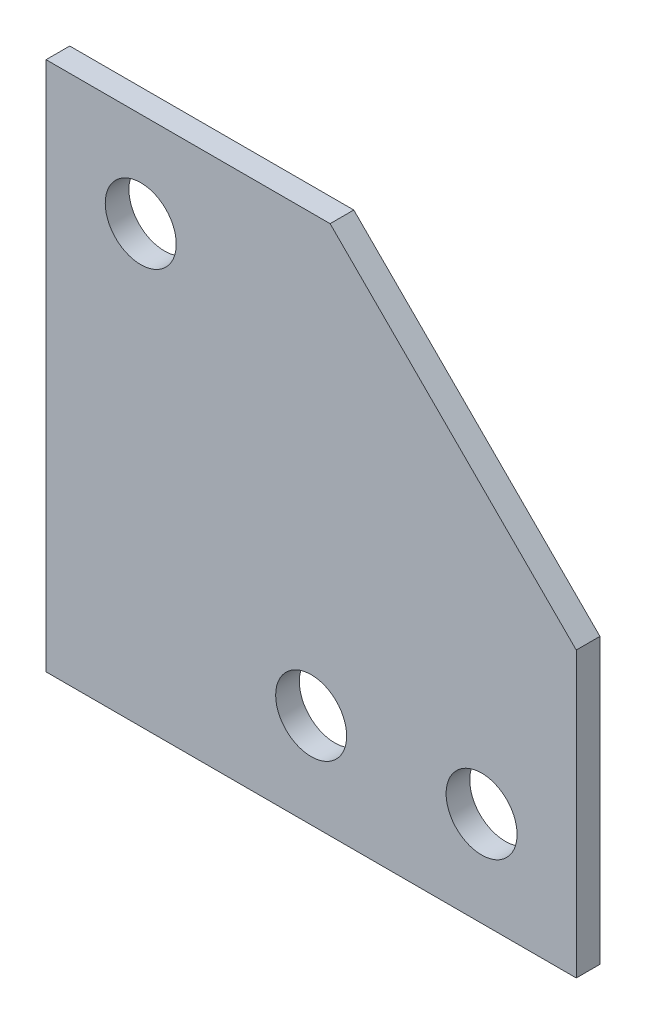
ISO-10303-21;
HEADER;
FILE_DESCRIPTION(('STEP AP214'),'2;1');
FILE_NAME('part.step','',(''),(''),'','','');
FILE_SCHEMA(('AUTOMOTIVE_DESIGN { 1 0 10303 214 1 1 1 1 }'));
ENDSEC;
DATA;
#1=APPLICATION_CONTEXT('core data for automotive mechanical design processes');
#2=APPLICATION_PROTOCOL_DEFINITION('international standard','automotive_design',2000,#1);
#3=PRODUCT_CONTEXT('',#1,'mechanical');
#4=PRODUCT('Part','Part','',(#3));
#5=PRODUCT_RELATED_PRODUCT_CATEGORY('part','',(#4));
#6=PRODUCT_DEFINITION_FORMATION('','',#4);
#7=PRODUCT_DEFINITION_CONTEXT('part definition',#1,'design');
#8=PRODUCT_DEFINITION('design','',#6,#7);
#9=PRODUCT_DEFINITION_SHAPE('','',#8);
#10=(LENGTH_UNIT() NAMED_UNIT(*) SI_UNIT(.MILLI.,.METRE.));
#11=(NAMED_UNIT(*) PLANE_ANGLE_UNIT() SI_UNIT($,.RADIAN.));
#12=(NAMED_UNIT(*) SI_UNIT($,.STERADIAN.) SOLID_ANGLE_UNIT());
#13=UNCERTAINTY_MEASURE_WITH_UNIT(LENGTH_MEASURE(1.E-05),#10,'distance_accuracy_value','');
#14=(GEOMETRIC_REPRESENTATION_CONTEXT(3) GLOBAL_UNCERTAINTY_ASSIGNED_CONTEXT((#13)) GLOBAL_UNIT_ASSIGNED_CONTEXT((#10,
#11,#12)) REPRESENTATION_CONTEXT('',''));
#15=CARTESIAN_POINT('',(0.,0.,0.));
#16=DIRECTION('',(0.,0.,1.));
#17=DIRECTION('',(1.,0.,0.));
#18=AXIS2_PLACEMENT_3D('',#15,#16,#17);
#19=CARTESIAN_POINT('',(0.,0.,1.5875));
#20=DIRECTION('',(1.,0.,0.));
#21=DIRECTION('',(0.,0.,-1.));
#22=AXIS2_PLACEMENT_3D('',#19,#20,#21);
#23=PLANE('',#22);
#24=DIRECTION('',(0.,-1.,0.));
#25=VECTOR('',#24,1.);
#26=CARTESIAN_POINT('',(0.,0.,0.));
#27=LINE('',#26,#25);
#28=CARTESIAN_POINT('',(0.,0.,0.));
#29=VERTEX_POINT('',#28);
#30=CARTESIAN_POINT('',(0.,-35.56,0.));
#31=VERTEX_POINT('',#30);
#32=EDGE_CURVE('E118',#29,#31,#27,.T.);
#33=ORIENTED_EDGE('',*,*,#32,.T.);
#34=DIRECTION('',(0.,0.,-1.));
#35=VECTOR('',#34,1.);
#36=CARTESIAN_POINT('',(0.,-35.56,1.5875));
#37=LINE('',#36,#35);
#38=CARTESIAN_POINT('',(0.,-35.56,1.5875));
#39=VERTEX_POINT('',#38);
#40=EDGE_CURVE('E11',#39,#31,#37,.T.);
#41=ORIENTED_EDGE('',*,*,#40,.F.);
#42=DIRECTION('',(0.,-1.,0.));
#43=VECTOR('',#42,1.);
#44=CARTESIAN_POINT('',(0.,0.,1.5875));
#45=LINE('',#44,#43);
#46=CARTESIAN_POINT('',(0.,0.,1.5875));
#47=VERTEX_POINT('',#46);
#48=EDGE_CURVE('E132',#47,#39,#45,.T.);
#49=ORIENTED_EDGE('',*,*,#48,.F.);
#50=DIRECTION('',(0.,0.,-1.));
#51=VECTOR('',#50,1.);
#52=CARTESIAN_POINT('',(0.,0.,1.5875));
#53=LINE('',#52,#51);
#54=EDGE_CURVE('E114',#47,#29,#53,.T.);
#55=ORIENTED_EDGE('',*,*,#54,.T.);
#56=EDGE_LOOP('',(#33,#41,#49,#55));
#57=FACE_BOUND('',#56,.T.);
#58=ADVANCED_FACE('F39',(#57),#23,.F.);
#59=CARTESIAN_POINT('',(0.,-35.56,1.5875));
#60=DIRECTION('',(0.,1.,0.));
#61=DIRECTION('',(0.,0.,1.));
#62=AXIS2_PLACEMENT_3D('',#59,#60,#61);
#63=PLANE('',#62);
#64=DIRECTION('',(1.,0.,0.));
#65=VECTOR('',#64,1.);
#66=CARTESIAN_POINT('',(0.,-35.56,0.));
#67=LINE('',#66,#65);
#68=CARTESIAN_POINT('',(35.56,-35.56,0.));
#69=VERTEX_POINT('',#68);
#70=EDGE_CURVE('E122',#31,#69,#67,.T.);
#71=ORIENTED_EDGE('',*,*,#70,.T.);
#72=DIRECTION('',(0.,0.,-1.));
#73=VECTOR('',#72,1.);
#74=CARTESIAN_POINT('',(35.56,-35.56,1.5875));
#75=LINE('',#74,#73);
#76=CARTESIAN_POINT('',(35.56,-35.56,1.5875));
#77=VERTEX_POINT('',#76);
#78=EDGE_CURVE('E48',#77,#69,#75,.T.);
#79=ORIENTED_EDGE('',*,*,#78,.F.);
#80=DIRECTION('',(1.,0.,0.));
#81=VECTOR('',#80,1.);
#82=CARTESIAN_POINT('',(0.,-35.56,1.5875));
#83=LINE('',#82,#81);
#84=EDGE_CURVE('E90',#39,#77,#83,.T.);
#85=ORIENTED_EDGE('',*,*,#84,.F.);
#86=ORIENTED_EDGE('',*,*,#40,.T.);
#87=EDGE_LOOP('',(#71,#79,#85,#86));
#88=FACE_BOUND('',#87,.T.);
#89=ADVANCED_FACE('F155',(#88),#63,.F.);
#90=CARTESIAN_POINT('',(35.56,-16.51,1.5875));
#91=DIRECTION('',(-1.,0.,0.));
#92=DIRECTION('',(0.,-1.,0.));
#93=AXIS2_PLACEMENT_3D('',#90,#91,#92);
#94=PLANE('',#93);
#95=DIRECTION('',(0.,1.,0.));
#96=VECTOR('',#95,1.);
#97=CARTESIAN_POINT('',(35.56,-16.51,0.));
#98=LINE('',#97,#96);
#99=CARTESIAN_POINT('',(35.56,-16.51,0.));
#100=VERTEX_POINT('',#99);
#101=EDGE_CURVE('E106',#69,#100,#98,.T.);
#102=ORIENTED_EDGE('',*,*,#101,.T.);
#103=DIRECTION('',(0.,0.,-1.));
#104=VECTOR('',#103,1.);
#105=CARTESIAN_POINT('',(35.56,-16.51,1.5875));
#106=LINE('',#105,#104);
#107=CARTESIAN_POINT('',(35.56,-16.51,1.5875));
#108=VERTEX_POINT('',#107);
#109=EDGE_CURVE('E103',#108,#100,#106,.T.);
#110=ORIENTED_EDGE('',*,*,#109,.F.);
#111=DIRECTION('',(0.,1.,0.));
#112=VECTOR('',#111,1.);
#113=CARTESIAN_POINT('',(35.56,-16.51,1.5875));
#114=LINE('',#113,#112);
#115=EDGE_CURVE('E94',#77,#108,#114,.T.);
#116=ORIENTED_EDGE('',*,*,#115,.F.);
#117=ORIENTED_EDGE('',*,*,#78,.T.);
#118=EDGE_LOOP('',(#102,#110,#116,#117));
#119=FACE_BOUND('',#118,.T.);
#120=ADVANCED_FACE('F104',(#119),#94,.F.);
#121=CARTESIAN_POINT('',(19.05,0.,1.5875));
#122=DIRECTION('',(-0.707106781186547,-0.707106781186548,0.));
#123=DIRECTION('',(0.707106781186548,-0.707106781186547,0.));
#124=AXIS2_PLACEMENT_3D('',#121,#122,#123);
#125=PLANE('',#124);
#126=DIRECTION('',(-0.707106781186548,0.707106781186547,0.));
#127=VECTOR('',#126,1.);
#128=CARTESIAN_POINT('',(19.05,0.,0.));
#129=LINE('',#128,#127);
#130=CARTESIAN_POINT('',(19.05,0.,0.));
#131=VERTEX_POINT('',#130);
#132=EDGE_CURVE('E76',#100,#131,#129,.T.);
#133=ORIENTED_EDGE('',*,*,#132,.T.);
#134=DIRECTION('',(0.,0.,-1.));
#135=VECTOR('',#134,1.);
#136=CARTESIAN_POINT('',(19.05,0.,1.5875));
#137=LINE('',#136,#135);
#138=CARTESIAN_POINT('',(19.05,0.,1.5875));
#139=VERTEX_POINT('',#138);
#140=EDGE_CURVE('E108',#139,#131,#137,.T.);
#141=ORIENTED_EDGE('',*,*,#140,.F.);
#142=DIRECTION('',(-0.707106781186548,0.707106781186547,0.));
#143=VECTOR('',#142,1.);
#144=CARTESIAN_POINT('',(19.05,0.,1.5875));
#145=LINE('',#144,#143);
#146=EDGE_CURVE('E98',#108,#139,#145,.T.);
#147=ORIENTED_EDGE('',*,*,#146,.F.);
#148=ORIENTED_EDGE('',*,*,#109,.T.);
#149=EDGE_LOOP('',(#133,#141,#147,#148));
#150=FACE_BOUND('',#149,.T.);
#151=ADVANCED_FACE('F110',(#150),#125,.F.);
#152=CARTESIAN_POINT('',(0.,0.,1.5875));
#153=DIRECTION('',(0.,-1.,0.));
#154=DIRECTION('',(0.,0.,-1.));
#155=AXIS2_PLACEMENT_3D('',#152,#153,#154);
#156=PLANE('',#155);
#157=DIRECTION('',(-1.,0.,0.));
#158=VECTOR('',#157,1.);
#159=CARTESIAN_POINT('',(0.,0.,0.));
#160=LINE('',#159,#158);
#161=EDGE_CURVE('E82',#131,#29,#160,.T.);
#162=ORIENTED_EDGE('',*,*,#161,.T.);
#163=ORIENTED_EDGE('',*,*,#54,.F.);
#164=DIRECTION('',(-1.,0.,0.));
#165=VECTOR('',#164,1.);
#166=CARTESIAN_POINT('',(0.,0.,1.5875));
#167=LINE('',#166,#165);
#168=EDGE_CURVE('E56',#139,#47,#167,.T.);
#169=ORIENTED_EDGE('',*,*,#168,.F.);
#170=ORIENTED_EDGE('',*,*,#140,.T.);
#171=EDGE_LOOP('',(#162,#163,#169,#170));
#172=FACE_BOUND('',#171,.T.);
#173=ADVANCED_FACE('F143',(#172),#156,.F.);
#174=CARTESIAN_POINT('',(0.,0.,1.5875));
#175=DIRECTION('',(0.,0.,1.));
#176=DIRECTION('',(1.,0.,0.));
#177=AXIS2_PLACEMENT_3D('',#174,#175,#176);
#178=PLANE('',#177);
#179=CARTESIAN_POINT('',(6.35,-6.35,1.5875));
#180=DIRECTION('',(0.,0.,-1.));
#181=DIRECTION('',(-1.,0.,0.));
#182=AXIS2_PLACEMENT_3D('',#179,#180,#181);
#183=CIRCLE('',#182,2.38125);
#184=CARTESIAN_POINT('',(3.96875,-6.35,1.5875));
#185=VERTEX_POINT('',#184);
#186=EDGE_CURVE('E224',#185,#185,#183,.T.);
#187=ORIENTED_EDGE('',*,*,#186,.T.);
#188=EDGE_LOOP('',(#187));
#189=FACE_BOUND('',#188,.T.);
#190=CARTESIAN_POINT('',(17.78,-29.21,1.5875));
#191=DIRECTION('',(0.,0.,-1.));
#192=DIRECTION('',(-1.,0.,0.));
#193=AXIS2_PLACEMENT_3D('',#190,#191,#192);
#194=CIRCLE('',#193,2.38125);
#195=CARTESIAN_POINT('',(15.39875,-29.21,1.5875));
#196=VERTEX_POINT('',#195);
#197=EDGE_CURVE('E237',#196,#196,#194,.T.);
#198=ORIENTED_EDGE('',*,*,#197,.T.);
#199=EDGE_LOOP('',(#198));
#200=FACE_BOUND('',#199,.T.);
#201=CARTESIAN_POINT('',(29.21,-29.21,1.5875));
#202=DIRECTION('',(0.,0.,-1.));
#203=DIRECTION('',(-1.,0.,0.));
#204=AXIS2_PLACEMENT_3D('',#201,#202,#203);
#205=CIRCLE('',#204,2.38125);
#206=CARTESIAN_POINT('',(26.82875,-29.21,1.5875));
#207=VERTEX_POINT('',#206);
#208=EDGE_CURVE('E123',#207,#207,#205,.T.);
#209=ORIENTED_EDGE('',*,*,#208,.T.);
#210=EDGE_LOOP('',(#209));
#211=FACE_BOUND('',#210,.T.);
#212=ORIENTED_EDGE('',*,*,#48,.T.);
#213=ORIENTED_EDGE('',*,*,#84,.T.);
#214=ORIENTED_EDGE('',*,*,#115,.T.);
#215=ORIENTED_EDGE('',*,*,#146,.T.);
#216=ORIENTED_EDGE('',*,*,#168,.T.);
#217=EDGE_LOOP('',(#212,#213,#214,#215,#216));
#218=FACE_BOUND('',#217,.T.);
#219=ADVANCED_FACE('F96',(#189,#200,#211,#218),#178,.T.);
#220=CARTESIAN_POINT('',(0.,0.,0.));
#221=DIRECTION('',(0.,0.,1.));
#222=DIRECTION('',(1.,0.,0.));
#223=AXIS2_PLACEMENT_3D('',#220,#221,#222);
#224=PLANE('',#223);
#225=CARTESIAN_POINT('',(6.35,-6.35,0.));
#226=DIRECTION('',(0.,0.,-1.));
#227=DIRECTION('',(-1.,0.,0.));
#228=AXIS2_PLACEMENT_3D('',#225,#226,#227);
#229=CIRCLE('',#228,2.38124999999999);
#230=CARTESIAN_POINT('',(3.96875000000001,-6.35,0.));
#231=VERTEX_POINT('',#230);
#232=EDGE_CURVE('E227',#231,#231,#229,.T.);
#233=ORIENTED_EDGE('',*,*,#232,.F.);
#234=EDGE_LOOP('',(#233));
#235=FACE_BOUND('',#234,.T.);
#236=CARTESIAN_POINT('',(17.78,-29.21,0.));
#237=DIRECTION('',(0.,0.,-1.));
#238=DIRECTION('',(-1.,0.,0.));
#239=AXIS2_PLACEMENT_3D('',#236,#237,#238);
#240=CIRCLE('',#239,2.38124999999999);
#241=CARTESIAN_POINT('',(15.39875,-29.21,0.));
#242=VERTEX_POINT('',#241);
#243=EDGE_CURVE('E231',#242,#242,#240,.T.);
#244=ORIENTED_EDGE('',*,*,#243,.F.);
#245=EDGE_LOOP('',(#244));
#246=FACE_BOUND('',#245,.T.);
#247=CARTESIAN_POINT('',(29.21,-29.21,0.));
#248=DIRECTION('',(0.,0.,-1.));
#249=DIRECTION('',(-1.,0.,0.));
#250=AXIS2_PLACEMENT_3D('',#247,#248,#249);
#251=CIRCLE('',#250,2.38124999999999);
#252=CARTESIAN_POINT('',(26.82875,-29.21,0.));
#253=VERTEX_POINT('',#252);
#254=EDGE_CURVE('E241',#253,#253,#251,.T.);
#255=ORIENTED_EDGE('',*,*,#254,.F.);
#256=EDGE_LOOP('',(#255));
#257=FACE_BOUND('',#256,.T.);
#258=ORIENTED_EDGE('',*,*,#32,.F.);
#259=ORIENTED_EDGE('',*,*,#161,.F.);
#260=ORIENTED_EDGE('',*,*,#132,.F.);
#261=ORIENTED_EDGE('',*,*,#101,.F.);
#262=ORIENTED_EDGE('',*,*,#70,.F.);
#263=EDGE_LOOP('',(#258,#259,#260,#261,#262));
#264=FACE_BOUND('',#263,.T.);
#265=ADVANCED_FACE('F139',(#235,#246,#257,#264),#224,.F.);
#266=CARTESIAN_POINT('',(29.21,-29.21,0.));
#267=DIRECTION('',(0.,0.,-1.));
#268=DIRECTION('',(-1.,0.,0.));
#269=AXIS2_PLACEMENT_3D('',#266,#267,#268);
#270=CYLINDRICAL_SURFACE('',#269,2.38124999999999);
#271=ORIENTED_EDGE('',*,*,#208,.F.);
#272=EDGE_LOOP('',(#271));
#273=FACE_BOUND('',#272,.T.);
#274=ORIENTED_EDGE('',*,*,#254,.T.);
#275=EDGE_LOOP('',(#274));
#276=FACE_BOUND('',#275,.T.);
#277=ADVANCED_FACE('F188',(#273,#276),#270,.F.);
#278=CARTESIAN_POINT('',(17.78,-29.21,0.));
#279=DIRECTION('',(0.,0.,-1.));
#280=DIRECTION('',(-1.,0.,0.));
#281=AXIS2_PLACEMENT_3D('',#278,#279,#280);
#282=CYLINDRICAL_SURFACE('',#281,2.38124999999999);
#283=ORIENTED_EDGE('',*,*,#197,.F.);
#284=EDGE_LOOP('',(#283));
#285=FACE_BOUND('',#284,.T.);
#286=ORIENTED_EDGE('',*,*,#243,.T.);
#287=EDGE_LOOP('',(#286));
#288=FACE_BOUND('',#287,.T.);
#289=ADVANCED_FACE('F197',(#285,#288),#282,.F.);
#290=CARTESIAN_POINT('',(6.35,-6.35,0.));
#291=DIRECTION('',(0.,0.,-1.));
#292=DIRECTION('',(-1.,0.,0.));
#293=AXIS2_PLACEMENT_3D('',#290,#291,#292);
#294=CYLINDRICAL_SURFACE('',#293,2.38124999999999);
#295=ORIENTED_EDGE('',*,*,#186,.F.);
#296=EDGE_LOOP('',(#295));
#297=FACE_BOUND('',#296,.T.);
#298=ORIENTED_EDGE('',*,*,#232,.T.);
#299=EDGE_LOOP('',(#298));
#300=FACE_BOUND('',#299,.T.);
#301=ADVANCED_FACE('F207',(#297,#300),#294,.F.);
#302=CLOSED_SHELL('',(#58,#89,#120,#151,#173,#219,#265,#277,#289,#301));
#303=MANIFOLD_SOLID_BREP('B2',#302);
#304=ADVANCED_BREP_SHAPE_REPRESENTATION('',(#18,#303),#14);
#305=SHAPE_DEFINITION_REPRESENTATION(#9,#304);
ENDSEC;
END-ISO-10303-21;
